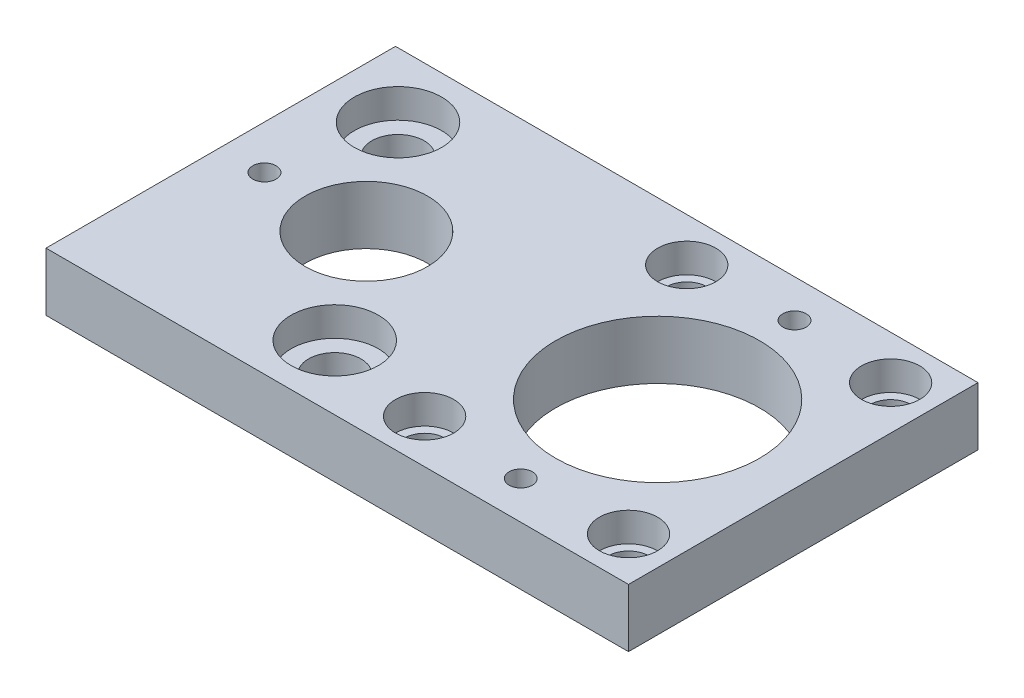
ISO-10303-21;
HEADER;
FILE_DESCRIPTION(('STEP AP214'),'2;1');
FILE_NAME('part.step','',(''),(''),'','','');
FILE_SCHEMA(('AUTOMOTIVE_DESIGN { 1 0 10303 214 1 1 1 1 }'));
ENDSEC;
DATA;
#1=APPLICATION_CONTEXT('core data for automotive mechanical design processes');
#2=APPLICATION_PROTOCOL_DEFINITION('international standard','automotive_design',2000,#1);
#3=PRODUCT_CONTEXT('',#1,'mechanical');
#4=PRODUCT('Part','Part','',(#3));
#5=PRODUCT_RELATED_PRODUCT_CATEGORY('part','',(#4));
#6=PRODUCT_DEFINITION_FORMATION('','',#4);
#7=PRODUCT_DEFINITION_CONTEXT('part definition',#1,'design');
#8=PRODUCT_DEFINITION('design','',#6,#7);
#9=PRODUCT_DEFINITION_SHAPE('','',#8);
#10=(LENGTH_UNIT() NAMED_UNIT(*) SI_UNIT(.MILLI.,.METRE.));
#11=(NAMED_UNIT(*) PLANE_ANGLE_UNIT() SI_UNIT($,.RADIAN.));
#12=(NAMED_UNIT(*) SI_UNIT($,.STERADIAN.) SOLID_ANGLE_UNIT());
#13=UNCERTAINTY_MEASURE_WITH_UNIT(LENGTH_MEASURE(1.E-05),#10,'distance_accuracy_value','');
#14=(GEOMETRIC_REPRESENTATION_CONTEXT(3) GLOBAL_UNCERTAINTY_ASSIGNED_CONTEXT((#13)) GLOBAL_UNIT_ASSIGNED_CONTEXT((#10,
#11,#12)) REPRESENTATION_CONTEXT('',''));
#15=CARTESIAN_POINT('',(0.,0.,0.));
#16=DIRECTION('',(0.,0.,1.));
#17=DIRECTION('',(1.,0.,0.));
#18=AXIS2_PLACEMENT_3D('',#15,#16,#17);
#19=CARTESIAN_POINT('',(11.5000000000001,2.,10.5));
#20=DIRECTION('',(0.,-1.,0.));
#21=DIRECTION('',(0.,0.,-1.));
#22=AXIS2_PLACEMENT_3D('',#19,#20,#21);
#23=CYLINDRICAL_SURFACE('',#22,0.699999999999999);
#24=CARTESIAN_POINT('',(11.5000000000001,0.,10.5));
#25=DIRECTION('',(0.,1.,0.));
#26=DIRECTION('',(0.,0.,1.));
#27=AXIS2_PLACEMENT_3D('',#24,#25,#26);
#28=CIRCLE('',#27,0.699999999999999);
#29=CARTESIAN_POINT('',(11.5000000000001,0.,11.2));
#30=VERTEX_POINT('',#29);
#31=EDGE_CURVE('E221',#30,#30,#28,.T.);
#32=ORIENTED_EDGE('',*,*,#31,.F.);
#33=EDGE_LOOP('',(#32));
#34=FACE_BOUND('',#33,.T.);
#35=CARTESIAN_POINT('',(11.5000000000001,1.,10.5));
#36=DIRECTION('',(0.,1.,0.));
#37=DIRECTION('',(0.,0.,1.));
#38=AXIS2_PLACEMENT_3D('',#35,#36,#37);
#39=CIRCLE('',#38,0.699999999999999);
#40=CARTESIAN_POINT('',(11.5000000000001,1.,11.2));
#41=VERTEX_POINT('',#40);
#42=EDGE_CURVE('E168',#41,#41,#39,.T.);
#43=ORIENTED_EDGE('',*,*,#42,.T.);
#44=EDGE_LOOP('',(#43));
#45=FACE_BOUND('',#44,.T.);
#46=ADVANCED_FACE('F71',(#34,#45),#23,.F.);
#47=CARTESIAN_POINT('',(18.5000000000001,2.,10.5));
#48=DIRECTION('',(0.,-1.,0.));
#49=DIRECTION('',(0.,0.,-1.));
#50=AXIS2_PLACEMENT_3D('',#47,#48,#49);
#51=CYLINDRICAL_SURFACE('',#50,0.699999999999998);
#52=CARTESIAN_POINT('',(18.5000000000001,0.,10.5));
#53=DIRECTION('',(0.,1.,0.));
#54=DIRECTION('',(0.,0.,1.));
#55=AXIS2_PLACEMENT_3D('',#52,#53,#54);
#56=CIRCLE('',#55,0.699999999999998);
#57=CARTESIAN_POINT('',(18.5000000000001,0.,11.2));
#58=VERTEX_POINT('',#57);
#59=EDGE_CURVE('E224',#58,#58,#56,.T.);
#60=ORIENTED_EDGE('',*,*,#59,.F.);
#61=EDGE_LOOP('',(#60));
#62=FACE_BOUND('',#61,.T.);
#63=CARTESIAN_POINT('',(18.5000000000001,1.,10.5));
#64=DIRECTION('',(0.,1.,0.));
#65=DIRECTION('',(0.,0.,1.));
#66=AXIS2_PLACEMENT_3D('',#63,#64,#65);
#67=CIRCLE('',#66,0.699999999999998);
#68=CARTESIAN_POINT('',(18.5000000000001,1.,11.2));
#69=VERTEX_POINT('',#68);
#70=EDGE_CURVE('E165',#69,#69,#67,.T.);
#71=ORIENTED_EDGE('',*,*,#70,.T.);
#72=EDGE_LOOP('',(#71));
#73=FACE_BOUND('',#72,.T.);
#74=ADVANCED_FACE('F259',(#62,#73),#51,.F.);
#75=CARTESIAN_POINT('',(18.5000000000001,2.,1.5));
#76=DIRECTION('',(0.,-1.,0.));
#77=DIRECTION('',(0.,0.,-1.));
#78=AXIS2_PLACEMENT_3D('',#75,#76,#77);
#79=CYLINDRICAL_SURFACE('',#78,0.699999999999998);
#80=CARTESIAN_POINT('',(18.5000000000001,0.,1.5));
#81=DIRECTION('',(0.,1.,0.));
#82=DIRECTION('',(0.,0.,1.));
#83=AXIS2_PLACEMENT_3D('',#80,#81,#82);
#84=CIRCLE('',#83,0.699999999999998);
#85=CARTESIAN_POINT('',(18.5000000000001,0.,2.2));
#86=VERTEX_POINT('',#85);
#87=EDGE_CURVE('E218',#86,#86,#84,.T.);
#88=ORIENTED_EDGE('',*,*,#87,.F.);
#89=EDGE_LOOP('',(#88));
#90=FACE_BOUND('',#89,.T.);
#91=CARTESIAN_POINT('',(18.5000000000001,1.,1.5));
#92=DIRECTION('',(0.,1.,0.));
#93=DIRECTION('',(0.,0.,1.));
#94=AXIS2_PLACEMENT_3D('',#91,#92,#93);
#95=CIRCLE('',#94,0.699999999999998);
#96=CARTESIAN_POINT('',(18.5000000000001,1.,2.2));
#97=VERTEX_POINT('',#96);
#98=EDGE_CURVE('E161',#97,#97,#95,.T.);
#99=ORIENTED_EDGE('',*,*,#98,.T.);
#100=EDGE_LOOP('',(#99));
#101=FACE_BOUND('',#100,.T.);
#102=ADVANCED_FACE('F265',(#90,#101),#79,.F.);
#103=CARTESIAN_POINT('',(11.5000000000001,2.,1.5));
#104=DIRECTION('',(0.,-1.,0.));
#105=DIRECTION('',(0.,0.,-1.));
#106=AXIS2_PLACEMENT_3D('',#103,#104,#105);
#107=CYLINDRICAL_SURFACE('',#106,0.7);
#108=CARTESIAN_POINT('',(11.5000000000001,0.,1.5));
#109=DIRECTION('',(0.,1.,0.));
#110=DIRECTION('',(0.,0.,1.));
#111=AXIS2_PLACEMENT_3D('',#108,#109,#110);
#112=CIRCLE('',#111,0.7);
#113=CARTESIAN_POINT('',(11.5000000000001,0.,2.2));
#114=VERTEX_POINT('',#113);
#115=EDGE_CURVE('E157',#114,#114,#112,.T.);
#116=ORIENTED_EDGE('',*,*,#115,.F.);
#117=EDGE_LOOP('',(#116));
#118=FACE_BOUND('',#117,.T.);
#119=CARTESIAN_POINT('',(11.5000000000001,1.,1.5));
#120=DIRECTION('',(0.,1.,0.));
#121=DIRECTION('',(0.,0.,1.));
#122=AXIS2_PLACEMENT_3D('',#119,#120,#121);
#123=CIRCLE('',#122,0.7);
#124=CARTESIAN_POINT('',(11.5000000000001,1.,2.2));
#125=VERTEX_POINT('',#124);
#126=EDGE_CURVE('E158',#125,#125,#123,.T.);
#127=ORIENTED_EDGE('',*,*,#126,.T.);
#128=EDGE_LOOP('',(#127));
#129=FACE_BOUND('',#128,.T.);
#130=ADVANCED_FACE('F275',(#118,#129),#107,.F.);
#131=CARTESIAN_POINT('',(7.7,2.,9.78582883923718));
#132=DIRECTION('',(0.,-1.,0.));
#133=DIRECTION('',(0.,0.,-1.));
#134=AXIS2_PLACEMENT_3D('',#131,#132,#133);
#135=CYLINDRICAL_SURFACE('',#134,0.9);
#136=CARTESIAN_POINT('',(7.7,0.,9.78582883923718));
#137=DIRECTION('',(0.,1.,0.));
#138=DIRECTION('',(0.,0.,1.));
#139=AXIS2_PLACEMENT_3D('',#136,#137,#138);
#140=CIRCLE('',#139,0.9);
#141=CARTESIAN_POINT('',(7.7,0.,10.6858288392372));
#142=VERTEX_POINT('',#141);
#143=EDGE_CURVE('E215',#142,#142,#140,.T.);
#144=ORIENTED_EDGE('',*,*,#143,.F.);
#145=EDGE_LOOP('',(#144));
#146=FACE_BOUND('',#145,.T.);
#147=CARTESIAN_POINT('',(7.7,1.,9.78582883923718));
#148=DIRECTION('',(0.,1.,0.));
#149=DIRECTION('',(0.,0.,1.));
#150=AXIS2_PLACEMENT_3D('',#147,#148,#149);
#151=CIRCLE('',#150,0.9);
#152=CARTESIAN_POINT('',(7.7,1.,10.6858288392372));
#153=VERTEX_POINT('',#152);
#154=EDGE_CURVE('E153',#153,#153,#151,.T.);
#155=ORIENTED_EDGE('',*,*,#154,.T.);
#156=EDGE_LOOP('',(#155));
#157=FACE_BOUND('',#156,.T.);
#158=ADVANCED_FACE('F271',(#146,#157),#135,.F.);
#159=CARTESIAN_POINT('',(2.3,2.,2.2141711607628));
#160=DIRECTION('',(0.,-1.,0.));
#161=DIRECTION('',(0.,0.,-1.));
#162=AXIS2_PLACEMENT_3D('',#159,#160,#161);
#163=CYLINDRICAL_SURFACE('',#162,0.9);
#164=CARTESIAN_POINT('',(2.3,0.,2.2141711607628));
#165=DIRECTION('',(0.,1.,0.));
#166=DIRECTION('',(0.,0.,1.));
#167=AXIS2_PLACEMENT_3D('',#164,#165,#166);
#168=CIRCLE('',#167,0.9);
#169=CARTESIAN_POINT('',(2.3,0.,3.1141711607628));
#170=VERTEX_POINT('',#169);
#171=EDGE_CURVE('E211',#170,#170,#168,.T.);
#172=ORIENTED_EDGE('',*,*,#171,.F.);
#173=EDGE_LOOP('',(#172));
#174=FACE_BOUND('',#173,.T.);
#175=CARTESIAN_POINT('',(2.3,1.,2.2141711607628));
#176=DIRECTION('',(0.,1.,0.));
#177=DIRECTION('',(0.,0.,1.));
#178=AXIS2_PLACEMENT_3D('',#175,#176,#177);
#179=CIRCLE('',#178,0.9);
#180=CARTESIAN_POINT('',(2.3,1.,3.1141711607628));
#181=VERTEX_POINT('',#180);
#182=EDGE_CURVE('E150',#181,#181,#179,.T.);
#183=ORIENTED_EDGE('',*,*,#182,.T.);
#184=EDGE_LOOP('',(#183));
#185=FACE_BOUND('',#184,.T.);
#186=ADVANCED_FACE('F348',(#174,#185),#163,.F.);
#187=CARTESIAN_POINT('',(0.,2.,0.));
#188=DIRECTION('',(0.,1.,0.));
#189=DIRECTION('',(0.,0.,1.));
#190=AXIS2_PLACEMENT_3D('',#187,#188,#189);
#191=PLANE('',#190);
#192=CARTESIAN_POINT('',(1.5,2.,6.));
#193=DIRECTION('',(0.,1.,0.));
#194=DIRECTION('',(0.,0.,1.));
#195=AXIS2_PLACEMENT_3D('',#192,#193,#194);
#196=CIRCLE('',#195,0.4);
#197=CARTESIAN_POINT('',(1.5,2.,6.4));
#198=VERTEX_POINT('',#197);
#199=EDGE_CURVE('E175',#198,#198,#196,.T.);
#200=ORIENTED_EDGE('',*,*,#199,.F.);
#201=EDGE_LOOP('',(#200));
#202=FACE_BOUND('',#201,.T.);
#203=CARTESIAN_POINT('',(15.,2.,10.7));
#204=DIRECTION('',(0.,1.,0.));
#205=DIRECTION('',(0.,0.,1.));
#206=AXIS2_PLACEMENT_3D('',#203,#204,#205);
#207=CIRCLE('',#206,0.400000000000001);
#208=CARTESIAN_POINT('',(15.,2.,11.1));
#209=VERTEX_POINT('',#208);
#210=EDGE_CURVE('E552',#209,#209,#207,.T.);
#211=ORIENTED_EDGE('',*,*,#210,.F.);
#212=EDGE_LOOP('',(#211));
#213=FACE_BOUND('',#212,.T.);
#214=CARTESIAN_POINT('',(15.,2.,1.3));
#215=DIRECTION('',(0.,1.,0.));
#216=DIRECTION('',(0.,0.,1.));
#217=AXIS2_PLACEMENT_3D('',#214,#215,#216);
#218=CIRCLE('',#217,0.4);
#219=CARTESIAN_POINT('',(15.,2.,1.7));
#220=VERTEX_POINT('',#219);
#221=EDGE_CURVE('E300',#220,#220,#218,.T.);
#222=ORIENTED_EDGE('',*,*,#221,.F.);
#223=EDGE_LOOP('',(#222));
#224=FACE_BOUND('',#223,.T.);
#225=CARTESIAN_POINT('',(11.5000000000001,2.,10.5));
#226=DIRECTION('',(0.,1.,0.));
#227=DIRECTION('',(0.,0.,1.));
#228=AXIS2_PLACEMENT_3D('',#225,#226,#227);
#229=CIRCLE('',#228,1.);
#230=CARTESIAN_POINT('',(11.5000000000001,2.,11.5));
#231=VERTEX_POINT('',#230);
#232=EDGE_CURVE('E184',#231,#231,#229,.T.);
#233=ORIENTED_EDGE('',*,*,#232,.F.);
#234=EDGE_LOOP('',(#233));
#235=FACE_BOUND('',#234,.T.);
#236=CARTESIAN_POINT('',(18.5000000000001,2.,10.5));
#237=DIRECTION('',(0.,1.,0.));
#238=DIRECTION('',(0.,0.,1.));
#239=AXIS2_PLACEMENT_3D('',#236,#237,#238);
#240=CIRCLE('',#239,1.);
#241=CARTESIAN_POINT('',(18.5000000000001,2.,11.5));
#242=VERTEX_POINT('',#241);
#243=EDGE_CURVE('E192',#242,#242,#240,.T.);
#244=ORIENTED_EDGE('',*,*,#243,.F.);
#245=EDGE_LOOP('',(#244));
#246=FACE_BOUND('',#245,.T.);
#247=CARTESIAN_POINT('',(18.5000000000001,2.,1.5));
#248=DIRECTION('',(0.,1.,0.));
#249=DIRECTION('',(0.,0.,1.));
#250=AXIS2_PLACEMENT_3D('',#247,#248,#249);
#251=CIRCLE('',#250,1.);
#252=CARTESIAN_POINT('',(18.5000000000001,2.,2.50000000000001));
#253=VERTEX_POINT('',#252);
#254=EDGE_CURVE('E198',#253,#253,#251,.T.);
#255=ORIENTED_EDGE('',*,*,#254,.F.);
#256=EDGE_LOOP('',(#255));
#257=FACE_BOUND('',#256,.T.);
#258=CARTESIAN_POINT('',(11.5000000000001,2.,1.5));
#259=DIRECTION('',(0.,1.,0.));
#260=DIRECTION('',(0.,0.,1.));
#261=AXIS2_PLACEMENT_3D('',#258,#259,#260);
#262=CIRCLE('',#261,1.);
#263=CARTESIAN_POINT('',(11.5000000000001,2.,2.5));
#264=VERTEX_POINT('',#263);
#265=EDGE_CURVE('E195',#264,#264,#262,.T.);
#266=ORIENTED_EDGE('',*,*,#265,.F.);
#267=EDGE_LOOP('',(#266));
#268=FACE_BOUND('',#267,.T.);
#269=CARTESIAN_POINT('',(2.3,2.,2.2141711607628));
#270=DIRECTION('',(0.,1.,0.));
#271=DIRECTION('',(0.,0.,1.));
#272=AXIS2_PLACEMENT_3D('',#269,#270,#271);
#273=CIRCLE('',#272,1.5);
#274=CARTESIAN_POINT('',(2.3,2.,3.7141711607628));
#275=VERTEX_POINT('',#274);
#276=EDGE_CURVE('E201',#275,#275,#273,.T.);
#277=ORIENTED_EDGE('',*,*,#276,.F.);
#278=EDGE_LOOP('',(#277));
#279=FACE_BOUND('',#278,.T.);
#280=CARTESIAN_POINT('',(7.7,2.,9.78582883923718));
#281=DIRECTION('',(0.,1.,0.));
#282=DIRECTION('',(0.,0.,1.));
#283=AXIS2_PLACEMENT_3D('',#280,#281,#282);
#284=CIRCLE('',#283,1.5);
#285=CARTESIAN_POINT('',(7.7,2.,11.2858288392372));
#286=VERTEX_POINT('',#285);
#287=EDGE_CURVE('E204',#286,#286,#284,.T.);
#288=ORIENTED_EDGE('',*,*,#287,.F.);
#289=EDGE_LOOP('',(#288));
#290=FACE_BOUND('',#289,.T.);
#291=CARTESIAN_POINT('',(5.,2.,6.));
#292=DIRECTION('',(0.,1.,0.));
#293=DIRECTION('',(0.,0.,1.));
#294=AXIS2_PLACEMENT_3D('',#291,#292,#293);
#295=CIRCLE('',#294,2.1);
#296=CARTESIAN_POINT('',(5.,2.,8.1));
#297=VERTEX_POINT('',#296);
#298=EDGE_CURVE('E141',#297,#297,#295,.T.);
#299=ORIENTED_EDGE('',*,*,#298,.F.);
#300=EDGE_LOOP('',(#299));
#301=FACE_BOUND('',#300,.T.);
#302=DIRECTION('',(0.,0.,1.));
#303=VECTOR('',#302,1.);
#304=CARTESIAN_POINT('',(0.,2.,0.));
#305=LINE('',#304,#303);
#306=CARTESIAN_POINT('',(0.,2.,0.));
#307=VERTEX_POINT('',#306);
#308=CARTESIAN_POINT('',(0.,2.,12.));
#309=VERTEX_POINT('',#308);
#310=EDGE_CURVE('E124',#307,#309,#305,.T.);
#311=ORIENTED_EDGE('',*,*,#310,.T.);
#312=DIRECTION('',(1.,0.,0.));
#313=VECTOR('',#312,1.);
#314=CARTESIAN_POINT('',(0.,2.,12.));
#315=LINE('',#314,#313);
#316=CARTESIAN_POINT('',(20.,2.,12.));
#317=VERTEX_POINT('',#316);
#318=EDGE_CURVE('E115',#309,#317,#315,.T.);
#319=ORIENTED_EDGE('',*,*,#318,.T.);
#320=DIRECTION('',(0.,0.,1.));
#321=VECTOR('',#320,1.);
#322=CARTESIAN_POINT('',(20.,2.,0.));
#323=LINE('',#322,#321);
#324=CARTESIAN_POINT('',(20.,2.,0.));
#325=VERTEX_POINT('',#324);
#326=EDGE_CURVE('E123',#325,#317,#323,.T.);
#327=ORIENTED_EDGE('',*,*,#326,.F.);
#328=DIRECTION('',(1.,0.,0.));
#329=VECTOR('',#328,1.);
#330=CARTESIAN_POINT('',(0.,2.,0.));
#331=LINE('',#330,#329);
#332=EDGE_CURVE('E134',#307,#325,#331,.T.);
#333=ORIENTED_EDGE('',*,*,#332,.F.);
#334=EDGE_LOOP('',(#311,#319,#327,#333));
#335=FACE_BOUND('',#334,.T.);
#336=CARTESIAN_POINT('',(15.,2.,6.));
#337=DIRECTION('',(0.,1.,0.));
#338=DIRECTION('',(0.,0.,1.));
#339=AXIS2_PLACEMENT_3D('',#336,#337,#338);
#340=CIRCLE('',#339,3.5);
#341=CARTESIAN_POINT('',(15.,2.,9.5));
#342=VERTEX_POINT('',#341);
#343=EDGE_CURVE('E229',#342,#342,#340,.T.);
#344=ORIENTED_EDGE('',*,*,#343,.F.);
#345=EDGE_LOOP('',(#344));
#346=FACE_BOUND('',#345,.T.);
#347=ADVANCED_FACE('F119',(#202,#213,#224,#235,#246,#257,#268,#279,#290,#301,#335,#346),#191,.T.);
#348=CARTESIAN_POINT('',(0.,0.,0.));
#349=DIRECTION('',(0.,1.,0.));
#350=DIRECTION('',(0.,0.,1.));
#351=AXIS2_PLACEMENT_3D('',#348,#349,#350);
#352=PLANE('',#351);
#353=CARTESIAN_POINT('',(1.5,0.,6.));
#354=DIRECTION('',(0.,1.,0.));
#355=DIRECTION('',(0.,0.,1.));
#356=AXIS2_PLACEMENT_3D('',#353,#354,#355);
#357=CIRCLE('',#356,0.4);
#358=CARTESIAN_POINT('',(1.5,0.,6.4));
#359=VERTEX_POINT('',#358);
#360=EDGE_CURVE('E75',#359,#359,#357,.F.);
#361=ORIENTED_EDGE('',*,*,#360,.F.);
#362=EDGE_LOOP('',(#361));
#363=FACE_BOUND('',#362,.T.);
#364=CARTESIAN_POINT('',(15.,0.,10.7));
#365=DIRECTION('',(0.,1.,0.));
#366=DIRECTION('',(0.,0.,1.));
#367=AXIS2_PLACEMENT_3D('',#364,#365,#366);
#368=CIRCLE('',#367,0.400000000000001);
#369=CARTESIAN_POINT('',(15.,0.,11.1));
#370=VERTEX_POINT('',#369);
#371=EDGE_CURVE('E174',#370,#370,#368,.F.);
#372=ORIENTED_EDGE('',*,*,#371,.F.);
#373=EDGE_LOOP('',(#372));
#374=FACE_BOUND('',#373,.T.);
#375=CARTESIAN_POINT('',(15.,0.,1.3));
#376=DIRECTION('',(0.,1.,0.));
#377=DIRECTION('',(0.,0.,1.));
#378=AXIS2_PLACEMENT_3D('',#375,#376,#377);
#379=CIRCLE('',#378,0.4);
#380=CARTESIAN_POINT('',(15.,0.,1.7));
#381=VERTEX_POINT('',#380);
#382=EDGE_CURVE('E172',#381,#381,#379,.F.);
#383=ORIENTED_EDGE('',*,*,#382,.F.);
#384=EDGE_LOOP('',(#383));
#385=FACE_BOUND('',#384,.T.);
#386=ORIENTED_EDGE('',*,*,#171,.T.);
#387=EDGE_LOOP('',(#386));
#388=FACE_BOUND('',#387,.T.);
#389=ORIENTED_EDGE('',*,*,#115,.T.);
#390=EDGE_LOOP('',(#389));
#391=FACE_BOUND('',#390,.T.);
#392=ORIENTED_EDGE('',*,*,#87,.T.);
#393=EDGE_LOOP('',(#392));
#394=FACE_BOUND('',#393,.T.);
#395=ORIENTED_EDGE('',*,*,#59,.T.);
#396=EDGE_LOOP('',(#395));
#397=FACE_BOUND('',#396,.T.);
#398=ORIENTED_EDGE('',*,*,#31,.T.);
#399=EDGE_LOOP('',(#398));
#400=FACE_BOUND('',#399,.T.);
#401=ORIENTED_EDGE('',*,*,#143,.T.);
#402=EDGE_LOOP('',(#401));
#403=FACE_BOUND('',#402,.T.);
#404=DIRECTION('',(0.,0.,1.));
#405=VECTOR('',#404,1.);
#406=CARTESIAN_POINT('',(0.,0.,0.));
#407=LINE('',#406,#405);
#408=CARTESIAN_POINT('',(0.,0.,0.));
#409=VERTEX_POINT('',#408);
#410=CARTESIAN_POINT('',(0.,0.,12.));
#411=VERTEX_POINT('',#410);
#412=EDGE_CURVE('E139',#409,#411,#407,.T.);
#413=ORIENTED_EDGE('',*,*,#412,.F.);
#414=DIRECTION('',(1.,0.,0.));
#415=VECTOR('',#414,1.);
#416=CARTESIAN_POINT('',(0.,0.,0.));
#417=LINE('',#416,#415);
#418=CARTESIAN_POINT('',(20.,0.,0.));
#419=VERTEX_POINT('',#418);
#420=EDGE_CURVE('E145',#409,#419,#417,.T.);
#421=ORIENTED_EDGE('',*,*,#420,.T.);
#422=DIRECTION('',(0.,0.,1.));
#423=VECTOR('',#422,1.);
#424=CARTESIAN_POINT('',(20.,0.,0.));
#425=LINE('',#424,#423);
#426=CARTESIAN_POINT('',(20.,0.,12.));
#427=VERTEX_POINT('',#426);
#428=EDGE_CURVE('E143',#419,#427,#425,.T.);
#429=ORIENTED_EDGE('',*,*,#428,.T.);
#430=DIRECTION('',(1.,0.,0.));
#431=VECTOR('',#430,1.);
#432=CARTESIAN_POINT('',(0.,0.,12.));
#433=LINE('',#432,#431);
#434=EDGE_CURVE('E129',#411,#427,#433,.T.);
#435=ORIENTED_EDGE('',*,*,#434,.F.);
#436=EDGE_LOOP('',(#413,#421,#429,#435));
#437=FACE_BOUND('',#436,.T.);
#438=CARTESIAN_POINT('',(5.,0.,6.));
#439=DIRECTION('',(0.,1.,0.));
#440=DIRECTION('',(0.,0.,1.));
#441=AXIS2_PLACEMENT_3D('',#438,#439,#440);
#442=CIRCLE('',#441,2.1);
#443=CARTESIAN_POINT('',(5.,0.,8.1));
#444=VERTEX_POINT('',#443);
#445=EDGE_CURVE('E232',#444,#444,#442,.T.);
#446=ORIENTED_EDGE('',*,*,#445,.T.);
#447=EDGE_LOOP('',(#446));
#448=FACE_BOUND('',#447,.T.);
#449=CARTESIAN_POINT('',(15.,0.,6.));
#450=DIRECTION('',(0.,1.,0.));
#451=DIRECTION('',(0.,0.,1.));
#452=AXIS2_PLACEMENT_3D('',#449,#450,#451);
#453=CIRCLE('',#452,3.5);
#454=CARTESIAN_POINT('',(15.,0.,9.5));
#455=VERTEX_POINT('',#454);
#456=EDGE_CURVE('E214',#455,#455,#453,.T.);
#457=ORIENTED_EDGE('',*,*,#456,.T.);
#458=EDGE_LOOP('',(#457));
#459=FACE_BOUND('',#458,.T.);
#460=ADVANCED_FACE('F240',(#363,#374,#385,#388,#391,#394,#397,#400,#403,#437,#448,#459),#352,.F.);
#461=CARTESIAN_POINT('',(0.,2.,0.));
#462=DIRECTION('',(1.,0.,0.));
#463=DIRECTION('',(0.,0.,-1.));
#464=AXIS2_PLACEMENT_3D('',#461,#462,#463);
#465=PLANE('',#464);
#466=ORIENTED_EDGE('',*,*,#412,.T.);
#467=DIRECTION('',(0.,-1.,0.));
#468=VECTOR('',#467,1.);
#469=CARTESIAN_POINT('',(0.,2.,12.));
#470=LINE('',#469,#468);
#471=EDGE_CURVE('E13',#309,#411,#470,.T.);
#472=ORIENTED_EDGE('',*,*,#471,.F.);
#473=ORIENTED_EDGE('',*,*,#310,.F.);
#474=DIRECTION('',(0.,-1.,0.));
#475=VECTOR('',#474,1.);
#476=CARTESIAN_POINT('',(0.,2.,0.));
#477=LINE('',#476,#475);
#478=EDGE_CURVE('E90',#307,#409,#477,.T.);
#479=ORIENTED_EDGE('',*,*,#478,.T.);
#480=EDGE_LOOP('',(#466,#472,#473,#479));
#481=FACE_BOUND('',#480,.T.);
#482=ADVANCED_FACE('F73',(#481),#465,.F.);
#483=CARTESIAN_POINT('',(0.,2.,12.));
#484=DIRECTION('',(0.,0.,-1.));
#485=DIRECTION('',(-1.,0.,0.));
#486=AXIS2_PLACEMENT_3D('',#483,#484,#485);
#487=PLANE('',#486);
#488=ORIENTED_EDGE('',*,*,#434,.T.);
#489=DIRECTION('',(0.,-1.,0.));
#490=VECTOR('',#489,1.);
#491=CARTESIAN_POINT('',(20.,2.,12.));
#492=LINE('',#491,#490);
#493=EDGE_CURVE('E81',#317,#427,#492,.T.);
#494=ORIENTED_EDGE('',*,*,#493,.F.);
#495=ORIENTED_EDGE('',*,*,#318,.F.);
#496=ORIENTED_EDGE('',*,*,#471,.T.);
#497=EDGE_LOOP('',(#488,#494,#495,#496));
#498=FACE_BOUND('',#497,.T.);
#499=ADVANCED_FACE('F128',(#498),#487,.F.);
#500=CARTESIAN_POINT('',(20.,2.,0.));
#501=DIRECTION('',(1.,0.,0.));
#502=DIRECTION('',(0.,0.,-1.));
#503=AXIS2_PLACEMENT_3D('',#500,#501,#502);
#504=PLANE('',#503);
#505=ORIENTED_EDGE('',*,*,#428,.F.);
#506=DIRECTION('',(0.,-1.,0.));
#507=VECTOR('',#506,1.);
#508=CARTESIAN_POINT('',(20.,2.,0.));
#509=LINE('',#508,#507);
#510=EDGE_CURVE('E104',#325,#419,#509,.T.);
#511=ORIENTED_EDGE('',*,*,#510,.F.);
#512=ORIENTED_EDGE('',*,*,#326,.T.);
#513=ORIENTED_EDGE('',*,*,#493,.T.);
#514=EDGE_LOOP('',(#505,#511,#512,#513));
#515=FACE_BOUND('',#514,.T.);
#516=ADVANCED_FACE('F133',(#515),#504,.T.);
#517=CARTESIAN_POINT('',(0.,2.,0.));
#518=DIRECTION('',(0.,0.,-1.));
#519=DIRECTION('',(-1.,0.,0.));
#520=AXIS2_PLACEMENT_3D('',#517,#518,#519);
#521=PLANE('',#520);
#522=ORIENTED_EDGE('',*,*,#420,.F.);
#523=ORIENTED_EDGE('',*,*,#478,.F.);
#524=ORIENTED_EDGE('',*,*,#332,.T.);
#525=ORIENTED_EDGE('',*,*,#510,.T.);
#526=EDGE_LOOP('',(#522,#523,#524,#525));
#527=FACE_BOUND('',#526,.T.);
#528=ADVANCED_FACE('F246',(#527),#521,.T.);
#529=CARTESIAN_POINT('',(5.,2.,6.));
#530=DIRECTION('',(0.,-1.,0.));
#531=DIRECTION('',(0.,0.,-1.));
#532=AXIS2_PLACEMENT_3D('',#529,#530,#531);
#533=CYLINDRICAL_SURFACE('',#532,2.1);
#534=ORIENTED_EDGE('',*,*,#298,.T.);
#535=EDGE_LOOP('',(#534));
#536=FACE_BOUND('',#535,.T.);
#537=ORIENTED_EDGE('',*,*,#445,.F.);
#538=EDGE_LOOP('',(#537));
#539=FACE_BOUND('',#538,.T.);
#540=ADVANCED_FACE('F243',(#536,#539),#533,.F.);
#541=CARTESIAN_POINT('',(15.,2.,6.));
#542=DIRECTION('',(0.,-1.,0.));
#543=DIRECTION('',(0.,0.,-1.));
#544=AXIS2_PLACEMENT_3D('',#541,#542,#543);
#545=CYLINDRICAL_SURFACE('',#544,3.5);
#546=ORIENTED_EDGE('',*,*,#343,.T.);
#547=EDGE_LOOP('',(#546));
#548=FACE_BOUND('',#547,.T.);
#549=ORIENTED_EDGE('',*,*,#456,.F.);
#550=EDGE_LOOP('',(#549));
#551=FACE_BOUND('',#550,.T.);
#552=ADVANCED_FACE('F245',(#548,#551),#545,.F.);
#553=CARTESIAN_POINT('',(2.3,-4.24264068711929,2.2141711607628));
#554=DIRECTION('',(0.,1.,0.));
#555=DIRECTION('',(0.,0.,1.));
#556=AXIS2_PLACEMENT_3D('',#553,#554,#555);
#557=CYLINDRICAL_SURFACE('',#556,1.5);
#558=CARTESIAN_POINT('',(2.3,1.,2.2141711607628));
#559=DIRECTION('',(0.,1.,0.));
#560=DIRECTION('',(0.,0.,1.));
#561=AXIS2_PLACEMENT_3D('',#558,#559,#560);
#562=CIRCLE('',#561,1.5);
#563=CARTESIAN_POINT('',(2.3,1.,3.7141711607628));
#564=VERTEX_POINT('',#563);
#565=EDGE_CURVE('E154',#564,#564,#562,.F.);
#566=ORIENTED_EDGE('',*,*,#565,.T.);
#567=EDGE_LOOP('',(#566));
#568=FACE_BOUND('',#567,.T.);
#569=ORIENTED_EDGE('',*,*,#276,.T.);
#570=EDGE_LOOP('',(#569));
#571=FACE_BOUND('',#570,.T.);
#572=ADVANCED_FACE('F253',(#568,#571),#557,.F.);
#573=CARTESIAN_POINT('',(0.,1.,0.));
#574=DIRECTION('',(0.,1.,0.));
#575=DIRECTION('',(0.,0.,1.));
#576=AXIS2_PLACEMENT_3D('',#573,#574,#575);
#577=PLANE('',#576);
#578=ORIENTED_EDGE('',*,*,#182,.F.);
#579=EDGE_LOOP('',(#578));
#580=FACE_BOUND('',#579,.T.);
#581=ORIENTED_EDGE('',*,*,#565,.F.);
#582=EDGE_LOOP('',(#581));
#583=FACE_BOUND('',#582,.T.);
#584=ADVANCED_FACE('F334',(#580,#583),#577,.T.);
#585=CARTESIAN_POINT('',(7.7,-4.24264068711929,9.78582883923718));
#586=DIRECTION('',(0.,1.,0.));
#587=DIRECTION('',(0.,0.,1.));
#588=AXIS2_PLACEMENT_3D('',#585,#586,#587);
#589=CYLINDRICAL_SURFACE('',#588,1.5);
#590=CARTESIAN_POINT('',(7.7,1.,9.78582883923718));
#591=DIRECTION('',(0.,1.,0.));
#592=DIRECTION('',(0.,0.,1.));
#593=AXIS2_PLACEMENT_3D('',#590,#591,#592);
#594=CIRCLE('',#593,1.5);
#595=CARTESIAN_POINT('',(7.7,1.,11.2858288392372));
#596=VERTEX_POINT('',#595);
#597=EDGE_CURVE('E171',#596,#596,#594,.F.);
#598=ORIENTED_EDGE('',*,*,#597,.T.);
#599=EDGE_LOOP('',(#598));
#600=FACE_BOUND('',#599,.T.);
#601=ORIENTED_EDGE('',*,*,#287,.T.);
#602=EDGE_LOOP('',(#601));
#603=FACE_BOUND('',#602,.T.);
#604=ADVANCED_FACE('F337',(#600,#603),#589,.F.);
#605=CARTESIAN_POINT('',(0.,1.,0.));
#606=DIRECTION('',(0.,1.,0.));
#607=DIRECTION('',(0.,0.,1.));
#608=AXIS2_PLACEMENT_3D('',#605,#606,#607);
#609=PLANE('',#608);
#610=ORIENTED_EDGE('',*,*,#154,.F.);
#611=EDGE_LOOP('',(#610));
#612=FACE_BOUND('',#611,.T.);
#613=ORIENTED_EDGE('',*,*,#597,.F.);
#614=EDGE_LOOP('',(#613));
#615=FACE_BOUND('',#614,.T.);
#616=ADVANCED_FACE('F332',(#612,#615),#609,.T.);
#617=CARTESIAN_POINT('',(11.5000000000001,-2.82842712474619,1.5));
#618=DIRECTION('',(0.,1.,0.));
#619=DIRECTION('',(0.,0.,1.));
#620=AXIS2_PLACEMENT_3D('',#617,#618,#619);
#621=CYLINDRICAL_SURFACE('',#620,1.);
#622=CARTESIAN_POINT('',(11.5000000000001,1.,1.5));
#623=DIRECTION('',(0.,1.,0.));
#624=DIRECTION('',(0.,0.,1.));
#625=AXIS2_PLACEMENT_3D('',#622,#623,#624);
#626=CIRCLE('',#625,1.);
#627=CARTESIAN_POINT('',(11.5000000000001,1.,2.5));
#628=VERTEX_POINT('',#627);
#629=EDGE_CURVE('E162',#628,#628,#626,.F.);
#630=ORIENTED_EDGE('',*,*,#629,.T.);
#631=EDGE_LOOP('',(#630));
#632=FACE_BOUND('',#631,.T.);
#633=ORIENTED_EDGE('',*,*,#265,.T.);
#634=EDGE_LOOP('',(#633));
#635=FACE_BOUND('',#634,.T.);
#636=ADVANCED_FACE('F328',(#632,#635),#621,.F.);
#637=CARTESIAN_POINT('',(0.,1.,0.));
#638=DIRECTION('',(0.,1.,0.));
#639=DIRECTION('',(0.,0.,1.));
#640=AXIS2_PLACEMENT_3D('',#637,#638,#639);
#641=PLANE('',#640);
#642=ORIENTED_EDGE('',*,*,#126,.F.);
#643=EDGE_LOOP('',(#642));
#644=FACE_BOUND('',#643,.T.);
#645=ORIENTED_EDGE('',*,*,#629,.F.);
#646=EDGE_LOOP('',(#645));
#647=FACE_BOUND('',#646,.T.);
#648=ADVANCED_FACE('F325',(#644,#647),#641,.T.);
#649=CARTESIAN_POINT('',(18.5000000000001,-2.82842712474619,1.5));
#650=DIRECTION('',(0.,1.,0.));
#651=DIRECTION('',(0.,0.,1.));
#652=AXIS2_PLACEMENT_3D('',#649,#650,#651);
#653=CYLINDRICAL_SURFACE('',#652,1.);
#654=CARTESIAN_POINT('',(18.5000000000001,1.,1.5));
#655=DIRECTION('',(0.,1.,0.));
#656=DIRECTION('',(0.,0.,1.));
#657=AXIS2_PLACEMENT_3D('',#654,#655,#656);
#658=CIRCLE('',#657,1.);
#659=CARTESIAN_POINT('',(18.5000000000001,1.,2.50000000000001));
#660=VERTEX_POINT('',#659);
#661=EDGE_CURVE('E293',#660,#660,#658,.F.);
#662=ORIENTED_EDGE('',*,*,#661,.T.);
#663=EDGE_LOOP('',(#662));
#664=FACE_BOUND('',#663,.T.);
#665=ORIENTED_EDGE('',*,*,#254,.T.);
#666=EDGE_LOOP('',(#665));
#667=FACE_BOUND('',#666,.T.);
#668=ADVANCED_FACE('F289',(#664,#667),#653,.F.);
#669=CARTESIAN_POINT('',(0.,1.,0.));
#670=DIRECTION('',(0.,1.,0.));
#671=DIRECTION('',(0.,0.,1.));
#672=AXIS2_PLACEMENT_3D('',#669,#670,#671);
#673=PLANE('',#672);
#674=ORIENTED_EDGE('',*,*,#98,.F.);
#675=EDGE_LOOP('',(#674));
#676=FACE_BOUND('',#675,.T.);
#677=ORIENTED_EDGE('',*,*,#661,.F.);
#678=EDGE_LOOP('',(#677));
#679=FACE_BOUND('',#678,.T.);
#680=ADVANCED_FACE('F285',(#676,#679),#673,.T.);
#681=CARTESIAN_POINT('',(18.5000000000001,-2.82842712474619,10.5));
#682=DIRECTION('',(0.,1.,0.));
#683=DIRECTION('',(0.,0.,1.));
#684=AXIS2_PLACEMENT_3D('',#681,#682,#683);
#685=CYLINDRICAL_SURFACE('',#684,1.);
#686=CARTESIAN_POINT('',(18.5000000000001,1.,10.5));
#687=DIRECTION('',(0.,1.,0.));
#688=DIRECTION('',(0.,0.,1.));
#689=AXIS2_PLACEMENT_3D('',#686,#687,#688);
#690=CIRCLE('',#689,1.);
#691=CARTESIAN_POINT('',(18.5000000000001,1.,11.5));
#692=VERTEX_POINT('',#691);
#693=EDGE_CURVE('E189',#692,#692,#690,.F.);
#694=ORIENTED_EDGE('',*,*,#693,.T.);
#695=EDGE_LOOP('',(#694));
#696=FACE_BOUND('',#695,.T.);
#697=ORIENTED_EDGE('',*,*,#243,.T.);
#698=EDGE_LOOP('',(#697));
#699=FACE_BOUND('',#698,.T.);
#700=ADVANCED_FACE('F288',(#696,#699),#685,.F.);
#701=CARTESIAN_POINT('',(0.,1.,0.));
#702=DIRECTION('',(0.,1.,0.));
#703=DIRECTION('',(0.,0.,1.));
#704=AXIS2_PLACEMENT_3D('',#701,#702,#703);
#705=PLANE('',#704);
#706=ORIENTED_EDGE('',*,*,#70,.F.);
#707=EDGE_LOOP('',(#706));
#708=FACE_BOUND('',#707,.T.);
#709=ORIENTED_EDGE('',*,*,#693,.F.);
#710=EDGE_LOOP('',(#709));
#711=FACE_BOUND('',#710,.T.);
#712=ADVANCED_FACE('F307',(#708,#711),#705,.T.);
#713=CARTESIAN_POINT('',(11.5000000000001,-2.82842712474619,10.5));
#714=DIRECTION('',(0.,1.,0.));
#715=DIRECTION('',(0.,0.,1.));
#716=AXIS2_PLACEMENT_3D('',#713,#714,#715);
#717=CYLINDRICAL_SURFACE('',#716,1.);
#718=CARTESIAN_POINT('',(11.5000000000001,1.,10.5));
#719=DIRECTION('',(0.,1.,0.));
#720=DIRECTION('',(0.,0.,1.));
#721=AXIS2_PLACEMENT_3D('',#718,#719,#720);
#722=CIRCLE('',#721,1.);
#723=CARTESIAN_POINT('',(11.5000000000001,1.,11.5));
#724=VERTEX_POINT('',#723);
#725=EDGE_CURVE('E180',#724,#724,#722,.F.);
#726=ORIENTED_EDGE('',*,*,#725,.T.);
#727=EDGE_LOOP('',(#726));
#728=FACE_BOUND('',#727,.T.);
#729=ORIENTED_EDGE('',*,*,#232,.T.);
#730=EDGE_LOOP('',(#729));
#731=FACE_BOUND('',#730,.T.);
#732=ADVANCED_FACE('F309',(#728,#731),#717,.F.);
#733=CARTESIAN_POINT('',(0.,1.,0.));
#734=DIRECTION('',(0.,1.,0.));
#735=DIRECTION('',(0.,0.,1.));
#736=AXIS2_PLACEMENT_3D('',#733,#734,#735);
#737=PLANE('',#736);
#738=ORIENTED_EDGE('',*,*,#42,.F.);
#739=EDGE_LOOP('',(#738));
#740=FACE_BOUND('',#739,.T.);
#741=ORIENTED_EDGE('',*,*,#725,.F.);
#742=EDGE_LOOP('',(#741));
#743=FACE_BOUND('',#742,.T.);
#744=ADVANCED_FACE('F316',(#740,#743),#737,.T.);
#745=CARTESIAN_POINT('',(15.,2.,1.3));
#746=DIRECTION('',(0.,-1.,0.));
#747=DIRECTION('',(0.,0.,-1.));
#748=AXIS2_PLACEMENT_3D('',#745,#746,#747);
#749=CYLINDRICAL_SURFACE('',#748,0.4);
#750=ORIENTED_EDGE('',*,*,#221,.T.);
#751=EDGE_LOOP('',(#750));
#752=FACE_BOUND('',#751,.T.);
#753=ORIENTED_EDGE('',*,*,#382,.T.);
#754=EDGE_LOOP('',(#753));
#755=FACE_BOUND('',#754,.T.);
#756=ADVANCED_FACE('F323',(#752,#755),#749,.F.);
#757=CARTESIAN_POINT('',(15.,2.,10.7));
#758=DIRECTION('',(0.,-1.,0.));
#759=DIRECTION('',(0.,0.,-1.));
#760=AXIS2_PLACEMENT_3D('',#757,#758,#759);
#761=CYLINDRICAL_SURFACE('',#760,0.400000000000001);
#762=ORIENTED_EDGE('',*,*,#210,.T.);
#763=EDGE_LOOP('',(#762));
#764=FACE_BOUND('',#763,.T.);
#765=ORIENTED_EDGE('',*,*,#371,.T.);
#766=EDGE_LOOP('',(#765));
#767=FACE_BOUND('',#766,.T.);
#768=ADVANCED_FACE('F526',(#764,#767),#761,.F.);
#769=CARTESIAN_POINT('',(1.5,2.,6.));
#770=DIRECTION('',(0.,-1.,0.));
#771=DIRECTION('',(0.,0.,-1.));
#772=AXIS2_PLACEMENT_3D('',#769,#770,#771);
#773=CYLINDRICAL_SURFACE('',#772,0.4);
#774=ORIENTED_EDGE('',*,*,#199,.T.);
#775=EDGE_LOOP('',(#774));
#776=FACE_BOUND('',#775,.T.);
#777=ORIENTED_EDGE('',*,*,#360,.T.);
#778=EDGE_LOOP('',(#777));
#779=FACE_BOUND('',#778,.T.);
#780=ADVANCED_FACE('F536',(#776,#779),#773,.F.);
#781=CLOSED_SHELL('',(#46,#74,#102,#130,#158,#186,#347,#460,#482,#499,#516,#528,#540,#552,#572,
#584,#604,#616,#636,#648,#668,#680,#700,#712,#732,#744,#756,#768,#780));
#782=MANIFOLD_SOLID_BREP('B2',#781);
#783=ADVANCED_BREP_SHAPE_REPRESENTATION('',(#18,#782),#14);
#784=SHAPE_DEFINITION_REPRESENTATION(#9,#783);
ENDSEC;
END-ISO-10303-21;
